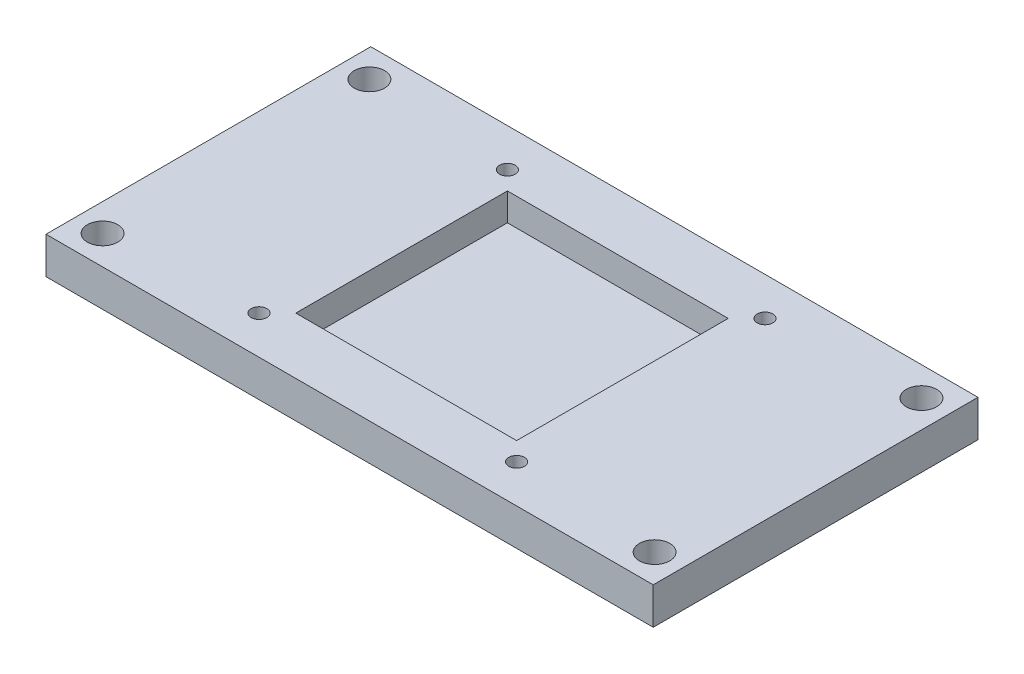
ISO-10303-21;
HEADER;
FILE_DESCRIPTION(('STEP AP214'),'2;1');
FILE_NAME('part.step','',(''),(''),'','','');
FILE_SCHEMA(('AUTOMOTIVE_DESIGN { 1 0 10303 214 1 1 1 1 }'));
ENDSEC;
DATA;
#1=APPLICATION_CONTEXT('core data for automotive mechanical design processes');
#2=APPLICATION_PROTOCOL_DEFINITION('international standard','automotive_design',2000,#1);
#3=PRODUCT_CONTEXT('',#1,'mechanical');
#4=PRODUCT('Part','Part','',(#3));
#5=PRODUCT_RELATED_PRODUCT_CATEGORY('part','',(#4));
#6=PRODUCT_DEFINITION_FORMATION('','',#4);
#7=PRODUCT_DEFINITION_CONTEXT('part definition',#1,'design');
#8=PRODUCT_DEFINITION('design','',#6,#7);
#9=PRODUCT_DEFINITION_SHAPE('','',#8);
#10=(LENGTH_UNIT() NAMED_UNIT(*) SI_UNIT(.MILLI.,.METRE.));
#11=(NAMED_UNIT(*) PLANE_ANGLE_UNIT() SI_UNIT($,.RADIAN.));
#12=(NAMED_UNIT(*) SI_UNIT($,.STERADIAN.) SOLID_ANGLE_UNIT());
#13=UNCERTAINTY_MEASURE_WITH_UNIT(LENGTH_MEASURE(1.E-05),#10,'distance_accuracy_value','');
#14=(GEOMETRIC_REPRESENTATION_CONTEXT(3) GLOBAL_UNCERTAINTY_ASSIGNED_CONTEXT((#13)) GLOBAL_UNIT_ASSIGNED_CONTEXT((#10,
#11,#12)) REPRESENTATION_CONTEXT('',''));
#15=CARTESIAN_POINT('',(0.,0.,0.));
#16=DIRECTION('',(0.,0.,1.));
#17=DIRECTION('',(1.,0.,0.));
#18=AXIS2_PLACEMENT_3D('',#15,#16,#17);
#19=CARTESIAN_POINT('',(0.,4.,0.));
#20=DIRECTION('',(0.,-1.,0.));
#21=DIRECTION('',(0.,0.,-1.));
#22=AXIS2_PLACEMENT_3D('',#19,#20,#21);
#23=PLANE('',#22);
#24=DIRECTION('',(1.,0.,0.));
#25=VECTOR('',#24,1.);
#26=CARTESIAN_POINT('',(21.,4.,-6.15000000000001));
#27=LINE('',#26,#25);
#28=CARTESIAN_POINT('',(21.,4.,-6.15000000000001));
#29=VERTEX_POINT('',#28);
#30=CARTESIAN_POINT('',(45.,4.,-6.15000000000001));
#31=VERTEX_POINT('',#30);
#32=EDGE_CURVE('E144',#29,#31,#27,.T.);
#33=ORIENTED_EDGE('',*,*,#32,.F.);
#34=DIRECTION('',(0.,0.,1.));
#35=VECTOR('',#34,1.);
#36=CARTESIAN_POINT('',(21.,4.,-29.15));
#37=LINE('',#36,#35);
#38=CARTESIAN_POINT('',(21.,4.,-29.15));
#39=VERTEX_POINT('',#38);
#40=EDGE_CURVE('E56',#39,#29,#37,.T.);
#41=ORIENTED_EDGE('',*,*,#40,.F.);
#42=DIRECTION('',(-1.,0.,0.));
#43=VECTOR('',#42,1.);
#44=CARTESIAN_POINT('',(21.,4.,-29.15));
#45=LINE('',#44,#43);
#46=CARTESIAN_POINT('',(45.,4.,-29.15));
#47=VERTEX_POINT('',#46);
#48=EDGE_CURVE('E135',#47,#39,#45,.T.);
#49=ORIENTED_EDGE('',*,*,#48,.F.);
#50=DIRECTION('',(0.,0.,-1.));
#51=VECTOR('',#50,1.);
#52=CARTESIAN_POINT('',(45.,4.,-29.15));
#53=LINE('',#52,#51);
#54=EDGE_CURVE('E138',#31,#47,#53,.T.);
#55=ORIENTED_EDGE('',*,*,#54,.F.);
#56=EDGE_LOOP('',(#33,#41,#49,#55));
#57=FACE_BOUND('',#56,.T.);
#58=CARTESIAN_POINT('',(19.,4.,-4.15000000000001));
#59=DIRECTION('',(0.,1.,0.));
#60=DIRECTION('',(0.,0.,1.));
#61=AXIS2_PLACEMENT_3D('',#58,#59,#60);
#62=CIRCLE('',#61,0.85);
#63=CARTESIAN_POINT('',(19.,4.,-3.30000000000001));
#64=VERTEX_POINT('',#63);
#65=EDGE_CURVE('E167',#64,#64,#62,.T.);
#66=ORIENTED_EDGE('',*,*,#65,.F.);
#67=EDGE_LOOP('',(#66));
#68=FACE_BOUND('',#67,.T.);
#69=CARTESIAN_POINT('',(47.,4.,-4.15000000000001));
#70=DIRECTION('',(0.,1.,0.));
#71=DIRECTION('',(0.,0.,1.));
#72=AXIS2_PLACEMENT_3D('',#69,#70,#71);
#73=CIRCLE('',#72,0.85);
#74=CARTESIAN_POINT('',(47.,4.,-3.30000000000001));
#75=VERTEX_POINT('',#74);
#76=EDGE_CURVE('E161',#75,#75,#73,.T.);
#77=ORIENTED_EDGE('',*,*,#76,.F.);
#78=EDGE_LOOP('',(#77));
#79=FACE_BOUND('',#78,.T.);
#80=CARTESIAN_POINT('',(47.,4.,-31.15));
#81=DIRECTION('',(0.,1.,0.));
#82=DIRECTION('',(0.,0.,1.));
#83=AXIS2_PLACEMENT_3D('',#80,#81,#82);
#84=CIRCLE('',#83,0.85);
#85=CARTESIAN_POINT('',(47.,4.,-30.3));
#86=VERTEX_POINT('',#85);
#87=EDGE_CURVE('E154',#86,#86,#84,.T.);
#88=ORIENTED_EDGE('',*,*,#87,.F.);
#89=EDGE_LOOP('',(#88));
#90=FACE_BOUND('',#89,.T.);
#91=CARTESIAN_POINT('',(19.,4.,-31.15));
#92=DIRECTION('',(0.,1.,0.));
#93=DIRECTION('',(0.,0.,1.));
#94=AXIS2_PLACEMENT_3D('',#91,#92,#93);
#95=CIRCLE('',#94,0.85);
#96=CARTESIAN_POINT('',(19.,4.,-30.3));
#97=VERTEX_POINT('',#96);
#98=EDGE_CURVE('E157',#97,#97,#95,.T.);
#99=ORIENTED_EDGE('',*,*,#98,.F.);
#100=EDGE_LOOP('',(#99));
#101=FACE_BOUND('',#100,.T.);
#102=DIRECTION('',(0.,0.,1.));
#103=VECTOR('',#102,1.);
#104=CARTESIAN_POINT('',(0.,4.,0.));
#105=LINE('',#104,#103);
#106=CARTESIAN_POINT('',(0.,4.,-35.3));
#107=VERTEX_POINT('',#106);
#108=CARTESIAN_POINT('',(0.,4.,0.));
#109=VERTEX_POINT('',#108);
#110=EDGE_CURVE('E202',#107,#109,#105,.T.);
#111=ORIENTED_EDGE('',*,*,#110,.T.);
#112=DIRECTION('',(1.,0.,0.));
#113=VECTOR('',#112,1.);
#114=CARTESIAN_POINT('',(0.,4.,0.));
#115=LINE('',#114,#113);
#116=CARTESIAN_POINT('',(66.,4.,0.));
#117=VERTEX_POINT('',#116);
#118=EDGE_CURVE('E93',#109,#117,#115,.T.);
#119=ORIENTED_EDGE('',*,*,#118,.T.);
#120=DIRECTION('',(0.,0.,-1.));
#121=VECTOR('',#120,1.);
#122=CARTESIAN_POINT('',(66.,4.,0.));
#123=LINE('',#122,#121);
#124=CARTESIAN_POINT('',(66.,4.,-35.3));
#125=VERTEX_POINT('',#124);
#126=EDGE_CURVE('E205',#117,#125,#123,.T.);
#127=ORIENTED_EDGE('',*,*,#126,.T.);
#128=DIRECTION('',(-1.,0.,0.));
#129=VECTOR('',#128,1.);
#130=CARTESIAN_POINT('',(0.,4.,-35.3));
#131=LINE('',#130,#129);
#132=EDGE_CURVE('E65',#125,#107,#131,.T.);
#133=ORIENTED_EDGE('',*,*,#132,.T.);
#134=EDGE_LOOP('',(#111,#119,#127,#133));
#135=FACE_BOUND('',#134,.T.);
#136=CARTESIAN_POINT('',(3.,4.,-32.15));
#137=DIRECTION('',(0.,1.,0.));
#138=DIRECTION('',(0.,0.,1.));
#139=AXIS2_PLACEMENT_3D('',#136,#137,#138);
#140=CIRCLE('',#139,1.65);
#141=CARTESIAN_POINT('',(3.,4.,-30.5));
#142=VERTEX_POINT('',#141);
#143=EDGE_CURVE('E196',#142,#142,#140,.T.);
#144=ORIENTED_EDGE('',*,*,#143,.F.);
#145=EDGE_LOOP('',(#144));
#146=FACE_BOUND('',#145,.T.);
#147=CARTESIAN_POINT('',(3.,4.,-3.15));
#148=DIRECTION('',(0.,1.,0.));
#149=DIRECTION('',(0.,0.,1.));
#150=AXIS2_PLACEMENT_3D('',#147,#148,#149);
#151=CIRCLE('',#150,1.65);
#152=CARTESIAN_POINT('',(3.,4.,-1.5));
#153=VERTEX_POINT('',#152);
#154=EDGE_CURVE('E190',#153,#153,#151,.T.);
#155=ORIENTED_EDGE('',*,*,#154,.F.);
#156=EDGE_LOOP('',(#155));
#157=FACE_BOUND('',#156,.T.);
#158=CARTESIAN_POINT('',(63.,4.,-3.15));
#159=DIRECTION('',(0.,1.,0.));
#160=DIRECTION('',(0.,0.,1.));
#161=AXIS2_PLACEMENT_3D('',#158,#159,#160);
#162=CIRCLE('',#161,1.65);
#163=CARTESIAN_POINT('',(63.,4.,-1.5));
#164=VERTEX_POINT('',#163);
#165=EDGE_CURVE('E184',#164,#164,#162,.T.);
#166=ORIENTED_EDGE('',*,*,#165,.F.);
#167=EDGE_LOOP('',(#166));
#168=FACE_BOUND('',#167,.T.);
#169=CARTESIAN_POINT('',(63.,4.,-32.15));
#170=DIRECTION('',(0.,1.,0.));
#171=DIRECTION('',(0.,0.,1.));
#172=AXIS2_PLACEMENT_3D('',#169,#170,#171);
#173=CIRCLE('',#172,1.65);
#174=CARTESIAN_POINT('',(63.,4.,-30.5));
#175=VERTEX_POINT('',#174);
#176=EDGE_CURVE('E178',#175,#175,#173,.T.);
#177=ORIENTED_EDGE('',*,*,#176,.F.);
#178=EDGE_LOOP('',(#177));
#179=FACE_BOUND('',#178,.T.);
#180=ADVANCED_FACE('F41',(#57,#68,#79,#90,#101,#135,#146,#157,#168,#179),#23,.F.);
#181=CARTESIAN_POINT('',(0.,0.,0.));
#182=DIRECTION('',(0.,-1.,0.));
#183=DIRECTION('',(0.,0.,-1.));
#184=AXIS2_PLACEMENT_3D('',#181,#182,#183);
#185=PLANE('',#184);
#186=CARTESIAN_POINT('',(19.,0.,-4.15000000000001));
#187=DIRECTION('',(0.,1.,0.));
#188=DIRECTION('',(0.,0.,1.));
#189=AXIS2_PLACEMENT_3D('',#186,#187,#188);
#190=CIRCLE('',#189,0.85);
#191=CARTESIAN_POINT('',(19.,0.,-3.30000000000001));
#192=VERTEX_POINT('',#191);
#193=EDGE_CURVE('E150',#192,#192,#190,.T.);
#194=ORIENTED_EDGE('',*,*,#193,.T.);
#195=EDGE_LOOP('',(#194));
#196=FACE_BOUND('',#195,.T.);
#197=CARTESIAN_POINT('',(47.,0.,-4.15000000000001));
#198=DIRECTION('',(0.,1.,0.));
#199=DIRECTION('',(0.,0.,1.));
#200=AXIS2_PLACEMENT_3D('',#197,#198,#199);
#201=CIRCLE('',#200,0.85);
#202=CARTESIAN_POINT('',(47.,0.,-3.30000000000001));
#203=VERTEX_POINT('',#202);
#204=EDGE_CURVE('E164',#203,#203,#201,.T.);
#205=ORIENTED_EDGE('',*,*,#204,.T.);
#206=EDGE_LOOP('',(#205));
#207=FACE_BOUND('',#206,.T.);
#208=CARTESIAN_POINT('',(47.,0.,-31.15));
#209=DIRECTION('',(0.,1.,0.));
#210=DIRECTION('',(0.,0.,1.));
#211=AXIS2_PLACEMENT_3D('',#208,#209,#210);
#212=CIRCLE('',#211,0.85);
#213=CARTESIAN_POINT('',(47.,0.,-30.3));
#214=VERTEX_POINT('',#213);
#215=EDGE_CURVE('E158',#214,#214,#212,.T.);
#216=ORIENTED_EDGE('',*,*,#215,.T.);
#217=EDGE_LOOP('',(#216));
#218=FACE_BOUND('',#217,.T.);
#219=CARTESIAN_POINT('',(19.,0.,-31.15));
#220=DIRECTION('',(0.,1.,0.));
#221=DIRECTION('',(0.,0.,1.));
#222=AXIS2_PLACEMENT_3D('',#219,#220,#221);
#223=CIRCLE('',#222,0.85);
#224=CARTESIAN_POINT('',(19.,0.,-30.3));
#225=VERTEX_POINT('',#224);
#226=EDGE_CURVE('E172',#225,#225,#223,.T.);
#227=ORIENTED_EDGE('',*,*,#226,.T.);
#228=EDGE_LOOP('',(#227));
#229=FACE_BOUND('',#228,.T.);
#230=CARTESIAN_POINT('',(63.,0.,-3.15));
#231=DIRECTION('',(0.,1.,0.));
#232=DIRECTION('',(0.,0.,1.));
#233=AXIS2_PLACEMENT_3D('',#230,#231,#232);
#234=CIRCLE('',#233,1.65);
#235=CARTESIAN_POINT('',(63.,0.,-1.5));
#236=VERTEX_POINT('',#235);
#237=EDGE_CURVE('E181',#236,#236,#234,.T.);
#238=ORIENTED_EDGE('',*,*,#237,.T.);
#239=EDGE_LOOP('',(#238));
#240=FACE_BOUND('',#239,.T.);
#241=CARTESIAN_POINT('',(3.,0.,-32.15));
#242=DIRECTION('',(0.,1.,0.));
#243=DIRECTION('',(0.,0.,1.));
#244=AXIS2_PLACEMENT_3D('',#241,#242,#243);
#245=CIRCLE('',#244,1.65);
#246=CARTESIAN_POINT('',(3.,0.,-30.5));
#247=VERTEX_POINT('',#246);
#248=EDGE_CURVE('E193',#247,#247,#245,.T.);
#249=ORIENTED_EDGE('',*,*,#248,.T.);
#250=EDGE_LOOP('',(#249));
#251=FACE_BOUND('',#250,.T.);
#252=DIRECTION('',(0.,0.,1.));
#253=VECTOR('',#252,1.);
#254=CARTESIAN_POINT('',(0.,0.,0.));
#255=LINE('',#254,#253);
#256=CARTESIAN_POINT('',(0.,0.,-35.3));
#257=VERTEX_POINT('',#256);
#258=CARTESIAN_POINT('',(0.,0.,0.));
#259=VERTEX_POINT('',#258);
#260=EDGE_CURVE('E199',#257,#259,#255,.T.);
#261=ORIENTED_EDGE('',*,*,#260,.F.);
#262=DIRECTION('',(-1.,0.,0.));
#263=VECTOR('',#262,1.);
#264=CARTESIAN_POINT('',(0.,0.,-35.3));
#265=LINE('',#264,#263);
#266=CARTESIAN_POINT('',(66.,0.,-35.3));
#267=VERTEX_POINT('',#266);
#268=EDGE_CURVE('E86',#267,#257,#265,.T.);
#269=ORIENTED_EDGE('',*,*,#268,.F.);
#270=DIRECTION('',(0.,0.,-1.));
#271=VECTOR('',#270,1.);
#272=CARTESIAN_POINT('',(66.,0.,0.));
#273=LINE('',#272,#271);
#274=CARTESIAN_POINT('',(66.,0.,0.));
#275=VERTEX_POINT('',#274);
#276=EDGE_CURVE('E213',#275,#267,#273,.T.);
#277=ORIENTED_EDGE('',*,*,#276,.F.);
#278=DIRECTION('',(1.,0.,0.));
#279=VECTOR('',#278,1.);
#280=CARTESIAN_POINT('',(0.,0.,0.));
#281=LINE('',#280,#279);
#282=EDGE_CURVE('E211',#259,#275,#281,.T.);
#283=ORIENTED_EDGE('',*,*,#282,.F.);
#284=EDGE_LOOP('',(#261,#269,#277,#283));
#285=FACE_BOUND('',#284,.T.);
#286=CARTESIAN_POINT('',(3.,0.,-3.15));
#287=DIRECTION('',(0.,1.,0.));
#288=DIRECTION('',(0.,0.,1.));
#289=AXIS2_PLACEMENT_3D('',#286,#287,#288);
#290=CIRCLE('',#289,1.65);
#291=CARTESIAN_POINT('',(3.,0.,-1.5));
#292=VERTEX_POINT('',#291);
#293=EDGE_CURVE('E187',#292,#292,#290,.T.);
#294=ORIENTED_EDGE('',*,*,#293,.T.);
#295=EDGE_LOOP('',(#294));
#296=FACE_BOUND('',#295,.T.);
#297=CARTESIAN_POINT('',(63.,0.,-32.15));
#298=DIRECTION('',(0.,1.,0.));
#299=DIRECTION('',(0.,0.,1.));
#300=AXIS2_PLACEMENT_3D('',#297,#298,#299);
#301=CIRCLE('',#300,1.65);
#302=CARTESIAN_POINT('',(63.,0.,-30.5));
#303=VERTEX_POINT('',#302);
#304=EDGE_CURVE('E175',#303,#303,#301,.T.);
#305=ORIENTED_EDGE('',*,*,#304,.T.);
#306=EDGE_LOOP('',(#305));
#307=FACE_BOUND('',#306,.T.);
#308=ADVANCED_FACE('F226',(#196,#207,#218,#229,#240,#251,#285,#296,#307),#185,.T.);
#309=CARTESIAN_POINT('',(0.,4.,0.));
#310=DIRECTION('',(1.,0.,0.));
#311=DIRECTION('',(0.,0.,-1.));
#312=AXIS2_PLACEMENT_3D('',#309,#310,#311);
#313=PLANE('',#312);
#314=ORIENTED_EDGE('',*,*,#260,.T.);
#315=DIRECTION('',(0.,-1.,0.));
#316=VECTOR('',#315,1.);
#317=CARTESIAN_POINT('',(0.,4.,0.));
#318=LINE('',#317,#316);
#319=EDGE_CURVE('E11',#109,#259,#318,.T.);
#320=ORIENTED_EDGE('',*,*,#319,.F.);
#321=ORIENTED_EDGE('',*,*,#110,.F.);
#322=DIRECTION('',(0.,-1.,0.));
#323=VECTOR('',#322,1.);
#324=CARTESIAN_POINT('',(0.,4.,-35.3));
#325=LINE('',#324,#323);
#326=EDGE_CURVE('E208',#107,#257,#325,.T.);
#327=ORIENTED_EDGE('',*,*,#326,.T.);
#328=EDGE_LOOP('',(#314,#320,#321,#327));
#329=FACE_BOUND('',#328,.T.);
#330=ADVANCED_FACE('F43',(#329),#313,.F.);
#331=CARTESIAN_POINT('',(0.,4.,0.));
#332=DIRECTION('',(0.,0.,-1.));
#333=DIRECTION('',(-1.,0.,0.));
#334=AXIS2_PLACEMENT_3D('',#331,#332,#333);
#335=PLANE('',#334);
#336=ORIENTED_EDGE('',*,*,#282,.T.);
#337=DIRECTION('',(0.,-1.,0.));
#338=VECTOR('',#337,1.);
#339=CARTESIAN_POINT('',(66.,4.,0.));
#340=LINE('',#339,#338);
#341=EDGE_CURVE('E49',#117,#275,#340,.T.);
#342=ORIENTED_EDGE('',*,*,#341,.F.);
#343=ORIENTED_EDGE('',*,*,#118,.F.);
#344=ORIENTED_EDGE('',*,*,#319,.T.);
#345=EDGE_LOOP('',(#336,#342,#343,#344));
#346=FACE_BOUND('',#345,.T.);
#347=ADVANCED_FACE('F242',(#346),#335,.F.);
#348=CARTESIAN_POINT('',(66.,4.,0.));
#349=DIRECTION('',(-1.,0.,0.));
#350=DIRECTION('',(0.,0.,1.));
#351=AXIS2_PLACEMENT_3D('',#348,#349,#350);
#352=PLANE('',#351);
#353=ORIENTED_EDGE('',*,*,#276,.T.);
#354=DIRECTION('',(0.,-1.,0.));
#355=VECTOR('',#354,1.);
#356=CARTESIAN_POINT('',(66.,4.,-35.3));
#357=LINE('',#356,#355);
#358=EDGE_CURVE('E217',#125,#267,#357,.T.);
#359=ORIENTED_EDGE('',*,*,#358,.F.);
#360=ORIENTED_EDGE('',*,*,#126,.F.);
#361=ORIENTED_EDGE('',*,*,#341,.T.);
#362=EDGE_LOOP('',(#353,#359,#360,#361));
#363=FACE_BOUND('',#362,.T.);
#364=ADVANCED_FACE('F222',(#363),#352,.F.);
#365=CARTESIAN_POINT('',(0.,4.,-35.3));
#366=DIRECTION('',(0.,0.,1.));
#367=DIRECTION('',(1.,0.,0.));
#368=AXIS2_PLACEMENT_3D('',#365,#366,#367);
#369=PLANE('',#368);
#370=ORIENTED_EDGE('',*,*,#268,.T.);
#371=ORIENTED_EDGE('',*,*,#326,.F.);
#372=ORIENTED_EDGE('',*,*,#132,.F.);
#373=ORIENTED_EDGE('',*,*,#358,.T.);
#374=EDGE_LOOP('',(#370,#371,#372,#373));
#375=FACE_BOUND('',#374,.T.);
#376=ADVANCED_FACE('F231',(#375),#369,.F.);
#377=CARTESIAN_POINT('',(3.,4.,-32.15));
#378=DIRECTION('',(0.,-1.,0.));
#379=DIRECTION('',(0.,0.,-1.));
#380=AXIS2_PLACEMENT_3D('',#377,#378,#379);
#381=CYLINDRICAL_SURFACE('',#380,1.65);
#382=ORIENTED_EDGE('',*,*,#143,.T.);
#383=EDGE_LOOP('',(#382));
#384=FACE_BOUND('',#383,.T.);
#385=ORIENTED_EDGE('',*,*,#248,.F.);
#386=EDGE_LOOP('',(#385));
#387=FACE_BOUND('',#386,.T.);
#388=ADVANCED_FACE('F233',(#384,#387),#381,.F.);
#389=CARTESIAN_POINT('',(3.,4.,-3.15));
#390=DIRECTION('',(0.,-1.,0.));
#391=DIRECTION('',(0.,0.,-1.));
#392=AXIS2_PLACEMENT_3D('',#389,#390,#391);
#393=CYLINDRICAL_SURFACE('',#392,1.65);
#394=ORIENTED_EDGE('',*,*,#154,.T.);
#395=EDGE_LOOP('',(#394));
#396=FACE_BOUND('',#395,.T.);
#397=ORIENTED_EDGE('',*,*,#293,.F.);
#398=EDGE_LOOP('',(#397));
#399=FACE_BOUND('',#398,.T.);
#400=ADVANCED_FACE('F239',(#396,#399),#393,.F.);
#401=CARTESIAN_POINT('',(63.,4.,-3.15));
#402=DIRECTION('',(0.,-1.,0.));
#403=DIRECTION('',(0.,0.,-1.));
#404=AXIS2_PLACEMENT_3D('',#401,#402,#403);
#405=CYLINDRICAL_SURFACE('',#404,1.65);
#406=ORIENTED_EDGE('',*,*,#165,.T.);
#407=EDGE_LOOP('',(#406));
#408=FACE_BOUND('',#407,.T.);
#409=ORIENTED_EDGE('',*,*,#237,.F.);
#410=EDGE_LOOP('',(#409));
#411=FACE_BOUND('',#410,.T.);
#412=ADVANCED_FACE('F258',(#408,#411),#405,.F.);
#413=CARTESIAN_POINT('',(63.,4.,-32.15));
#414=DIRECTION('',(0.,-1.,0.));
#415=DIRECTION('',(0.,0.,-1.));
#416=AXIS2_PLACEMENT_3D('',#413,#414,#415);
#417=CYLINDRICAL_SURFACE('',#416,1.65);
#418=ORIENTED_EDGE('',*,*,#176,.T.);
#419=EDGE_LOOP('',(#418));
#420=FACE_BOUND('',#419,.T.);
#421=ORIENTED_EDGE('',*,*,#304,.F.);
#422=EDGE_LOOP('',(#421));
#423=FACE_BOUND('',#422,.T.);
#424=ADVANCED_FACE('F262',(#420,#423),#417,.F.);
#425=CARTESIAN_POINT('',(19.,0.,-31.15));
#426=DIRECTION('',(0.,1.,0.));
#427=DIRECTION('',(0.,0.,1.));
#428=AXIS2_PLACEMENT_3D('',#425,#426,#427);
#429=CYLINDRICAL_SURFACE('',#428,0.85);
#430=ORIENTED_EDGE('',*,*,#226,.F.);
#431=EDGE_LOOP('',(#430));
#432=FACE_BOUND('',#431,.T.);
#433=ORIENTED_EDGE('',*,*,#98,.T.);
#434=EDGE_LOOP('',(#433));
#435=FACE_BOUND('',#434,.T.);
#436=ADVANCED_FACE('F266',(#432,#435),#429,.F.);
#437=CARTESIAN_POINT('',(47.,0.,-31.15));
#438=DIRECTION('',(0.,1.,0.));
#439=DIRECTION('',(0.,0.,1.));
#440=AXIS2_PLACEMENT_3D('',#437,#438,#439);
#441=CYLINDRICAL_SURFACE('',#440,0.85);
#442=ORIENTED_EDGE('',*,*,#215,.F.);
#443=EDGE_LOOP('',(#442));
#444=FACE_BOUND('',#443,.T.);
#445=ORIENTED_EDGE('',*,*,#87,.T.);
#446=EDGE_LOOP('',(#445));
#447=FACE_BOUND('',#446,.T.);
#448=ADVANCED_FACE('F270',(#444,#447),#441,.F.);
#449=CARTESIAN_POINT('',(47.,0.,-4.15000000000001));
#450=DIRECTION('',(0.,1.,0.));
#451=DIRECTION('',(0.,0.,1.));
#452=AXIS2_PLACEMENT_3D('',#449,#450,#451);
#453=CYLINDRICAL_SURFACE('',#452,0.85);
#454=ORIENTED_EDGE('',*,*,#204,.F.);
#455=EDGE_LOOP('',(#454));
#456=FACE_BOUND('',#455,.T.);
#457=ORIENTED_EDGE('',*,*,#76,.T.);
#458=EDGE_LOOP('',(#457));
#459=FACE_BOUND('',#458,.T.);
#460=ADVANCED_FACE('F274',(#456,#459),#453,.F.);
#461=CARTESIAN_POINT('',(19.,0.,-4.15000000000001));
#462=DIRECTION('',(0.,1.,0.));
#463=DIRECTION('',(0.,0.,1.));
#464=AXIS2_PLACEMENT_3D('',#461,#462,#463);
#465=CYLINDRICAL_SURFACE('',#464,0.85);
#466=ORIENTED_EDGE('',*,*,#193,.F.);
#467=EDGE_LOOP('',(#466));
#468=FACE_BOUND('',#467,.T.);
#469=ORIENTED_EDGE('',*,*,#65,.T.);
#470=EDGE_LOOP('',(#469));
#471=FACE_BOUND('',#470,.T.);
#472=ADVANCED_FACE('F272',(#468,#471),#465,.F.);
#473=CARTESIAN_POINT('',(21.,1.,-29.15));
#474=DIRECTION('',(-1.,0.,0.));
#475=DIRECTION('',(0.,0.,1.));
#476=AXIS2_PLACEMENT_3D('',#473,#474,#475);
#477=PLANE('',#476);
#478=ORIENTED_EDGE('',*,*,#40,.T.);
#479=DIRECTION('',(0.,1.,0.));
#480=VECTOR('',#479,1.);
#481=CARTESIAN_POINT('',(21.,1.,-6.15000000000001));
#482=LINE('',#481,#480);
#483=CARTESIAN_POINT('',(21.,1.,-6.15000000000001));
#484=VERTEX_POINT('',#483);
#485=EDGE_CURVE('E113',#484,#29,#482,.T.);
#486=ORIENTED_EDGE('',*,*,#485,.F.);
#487=DIRECTION('',(0.,0.,1.));
#488=VECTOR('',#487,1.);
#489=CARTESIAN_POINT('',(21.,1.,-29.15));
#490=LINE('',#489,#488);
#491=CARTESIAN_POINT('',(21.,1.,-29.15));
#492=VERTEX_POINT('',#491);
#493=EDGE_CURVE('E117',#492,#484,#490,.T.);
#494=ORIENTED_EDGE('',*,*,#493,.F.);
#495=DIRECTION('',(0.,1.,0.));
#496=VECTOR('',#495,1.);
#497=CARTESIAN_POINT('',(21.,1.,-29.15));
#498=LINE('',#497,#496);
#499=EDGE_CURVE('E148',#492,#39,#498,.T.);
#500=ORIENTED_EDGE('',*,*,#499,.T.);
#501=EDGE_LOOP('',(#478,#486,#494,#500));
#502=FACE_BOUND('',#501,.T.);
#503=ADVANCED_FACE('F115',(#502),#477,.F.);
#504=CARTESIAN_POINT('',(21.,1.,-29.15));
#505=DIRECTION('',(0.,0.,-1.));
#506=DIRECTION('',(-1.,0.,0.));
#507=AXIS2_PLACEMENT_3D('',#504,#505,#506);
#508=PLANE('',#507);
#509=ORIENTED_EDGE('',*,*,#48,.T.);
#510=ORIENTED_EDGE('',*,*,#499,.F.);
#511=DIRECTION('',(-1.,0.,0.));
#512=VECTOR('',#511,1.);
#513=CARTESIAN_POINT('',(21.,1.,-29.15));
#514=LINE('',#513,#512);
#515=CARTESIAN_POINT('',(45.,1.,-29.15));
#516=VERTEX_POINT('',#515);
#517=EDGE_CURVE('E123',#516,#492,#514,.T.);
#518=ORIENTED_EDGE('',*,*,#517,.F.);
#519=DIRECTION('',(0.,1.,0.));
#520=VECTOR('',#519,1.);
#521=CARTESIAN_POINT('',(45.,1.,-29.15));
#522=LINE('',#521,#520);
#523=EDGE_CURVE('E151',#516,#47,#522,.T.);
#524=ORIENTED_EDGE('',*,*,#523,.T.);
#525=EDGE_LOOP('',(#509,#510,#518,#524));
#526=FACE_BOUND('',#525,.T.);
#527=ADVANCED_FACE('F283',(#526),#508,.F.);
#528=CARTESIAN_POINT('',(45.,1.,-29.15));
#529=DIRECTION('',(1.,0.,0.));
#530=DIRECTION('',(0.,0.,-1.));
#531=AXIS2_PLACEMENT_3D('',#528,#529,#530);
#532=PLANE('',#531);
#533=ORIENTED_EDGE('',*,*,#54,.T.);
#534=ORIENTED_EDGE('',*,*,#523,.F.);
#535=DIRECTION('',(0.,0.,-1.));
#536=VECTOR('',#535,1.);
#537=CARTESIAN_POINT('',(45.,1.,-29.15));
#538=LINE('',#537,#536);
#539=CARTESIAN_POINT('',(45.,1.,-6.15000000000001));
#540=VERTEX_POINT('',#539);
#541=EDGE_CURVE('E131',#540,#516,#538,.T.);
#542=ORIENTED_EDGE('',*,*,#541,.F.);
#543=DIRECTION('',(0.,1.,0.));
#544=VECTOR('',#543,1.);
#545=CARTESIAN_POINT('',(45.,1.,-6.15000000000001));
#546=LINE('',#545,#544);
#547=EDGE_CURVE('E122',#540,#31,#546,.T.);
#548=ORIENTED_EDGE('',*,*,#547,.T.);
#549=EDGE_LOOP('',(#533,#534,#542,#548));
#550=FACE_BOUND('',#549,.T.);
#551=ADVANCED_FACE('F286',(#550),#532,.F.);
#552=CARTESIAN_POINT('',(21.,1.,-6.15000000000001));
#553=DIRECTION('',(0.,0.,1.));
#554=DIRECTION('',(1.,0.,0.));
#555=AXIS2_PLACEMENT_3D('',#552,#553,#554);
#556=PLANE('',#555);
#557=ORIENTED_EDGE('',*,*,#32,.T.);
#558=ORIENTED_EDGE('',*,*,#547,.F.);
#559=DIRECTION('',(1.,0.,0.));
#560=VECTOR('',#559,1.);
#561=CARTESIAN_POINT('',(21.,1.,-6.15000000000001));
#562=LINE('',#561,#560);
#563=EDGE_CURVE('E126',#484,#540,#562,.T.);
#564=ORIENTED_EDGE('',*,*,#563,.F.);
#565=ORIENTED_EDGE('',*,*,#485,.T.);
#566=EDGE_LOOP('',(#557,#558,#564,#565));
#567=FACE_BOUND('',#566,.T.);
#568=ADVANCED_FACE('F127',(#567),#556,.F.);
#569=CARTESIAN_POINT('',(0.,1.,0.));
#570=DIRECTION('',(0.,1.,0.));
#571=DIRECTION('',(0.,0.,1.));
#572=AXIS2_PLACEMENT_3D('',#569,#570,#571);
#573=PLANE('',#572);
#574=ORIENTED_EDGE('',*,*,#493,.T.);
#575=ORIENTED_EDGE('',*,*,#563,.T.);
#576=ORIENTED_EDGE('',*,*,#541,.T.);
#577=ORIENTED_EDGE('',*,*,#517,.T.);
#578=EDGE_LOOP('',(#574,#575,#576,#577));
#579=FACE_BOUND('',#578,.T.);
#580=ADVANCED_FACE('F133',(#579),#573,.T.);
#581=CLOSED_SHELL('',(#180,#308,#330,#347,#364,#376,#388,#400,#412,#424,#436,#448,#460,#472,
#503,#527,#551,#568,#580));
#582=MANIFOLD_SOLID_BREP('B2',#581);
#583=ADVANCED_BREP_SHAPE_REPRESENTATION('',(#18,#582),#14);
#584=SHAPE_DEFINITION_REPRESENTATION(#9,#583);
ENDSEC;
END-ISO-10303-21;
